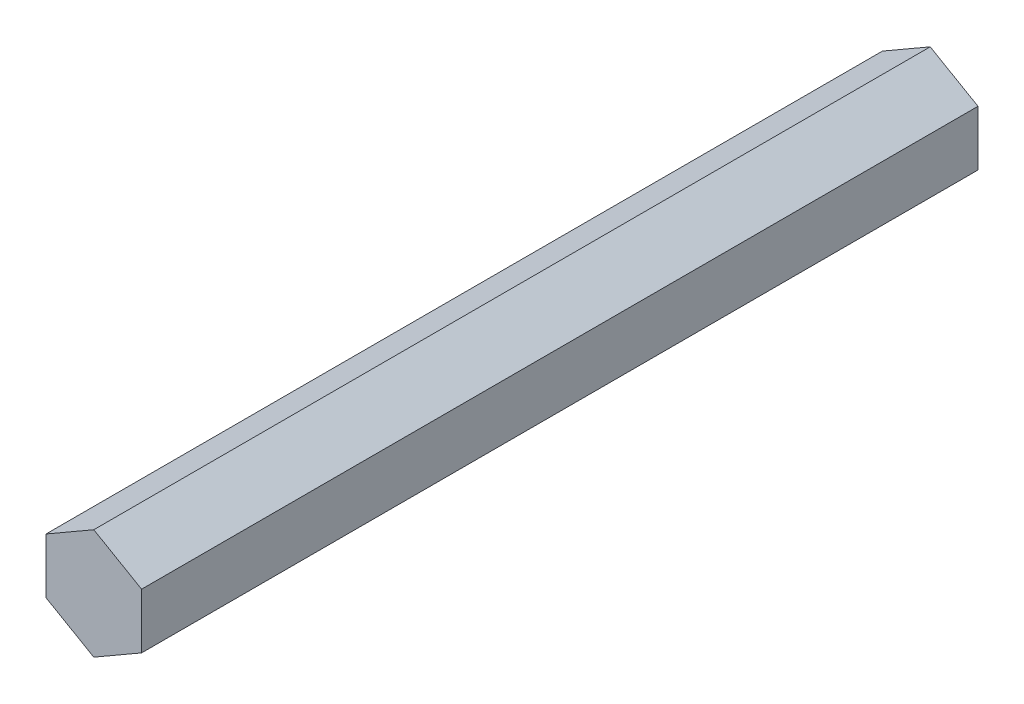
ISO-10303-21;
HEADER;
FILE_DESCRIPTION(('STEP AP214'),'2;1');
FILE_NAME('part.step','',(''),(''),'','','');
FILE_SCHEMA(('AUTOMOTIVE_DESIGN { 1 0 10303 214 1 1 1 1 }'));
ENDSEC;
DATA;
#1=APPLICATION_CONTEXT('core data for automotive mechanical design processes');
#2=APPLICATION_PROTOCOL_DEFINITION('international standard','automotive_design',2000,#1);
#3=PRODUCT_CONTEXT('',#1,'mechanical');
#4=PRODUCT('Part','Part','',(#3));
#5=PRODUCT_RELATED_PRODUCT_CATEGORY('part','',(#4));
#6=PRODUCT_DEFINITION_FORMATION('','',#4);
#7=PRODUCT_DEFINITION_CONTEXT('part definition',#1,'design');
#8=PRODUCT_DEFINITION('design','',#6,#7);
#9=PRODUCT_DEFINITION_SHAPE('','',#8);
#10=(LENGTH_UNIT() NAMED_UNIT(*) SI_UNIT(.MILLI.,.METRE.));
#11=(NAMED_UNIT(*) PLANE_ANGLE_UNIT() SI_UNIT($,.RADIAN.));
#12=(NAMED_UNIT(*) SI_UNIT($,.STERADIAN.) SOLID_ANGLE_UNIT());
#13=UNCERTAINTY_MEASURE_WITH_UNIT(LENGTH_MEASURE(1.E-05),#10,'distance_accuracy_value','');
#14=(GEOMETRIC_REPRESENTATION_CONTEXT(3) GLOBAL_UNCERTAINTY_ASSIGNED_CONTEXT((#13)) GLOBAL_UNIT_ASSIGNED_CONTEXT((#10,
#11,#12)) REPRESENTATION_CONTEXT('',''));
#15=CARTESIAN_POINT('',(0.,0.,0.));
#16=DIRECTION('',(0.,0.,1.));
#17=DIRECTION('',(1.,0.,0.));
#18=AXIS2_PLACEMENT_3D('',#15,#16,#17);
#19=CARTESIAN_POINT('',(-6.35,3.66617420935413,55.5625));
#20=DIRECTION('',(0.5,-0.866025403784439,0.));
#21=DIRECTION('',(0.866025403784439,0.5,0.));
#22=AXIS2_PLACEMENT_3D('',#19,#20,#21);
#23=PLANE('',#22);
#24=DIRECTION('',(-0.866025403784439,-0.5,0.));
#25=VECTOR('',#24,1.);
#26=CARTESIAN_POINT('',(-6.35,3.66617420935413,-55.5625));
#27=LINE('',#26,#25);
#28=CARTESIAN_POINT('',(0.,7.33234841870825,-55.5625));
#29=VERTEX_POINT('',#28);
#30=CARTESIAN_POINT('',(-6.35,3.66617420935413,-55.5625));
#31=VERTEX_POINT('',#30);
#32=EDGE_CURVE('E119',#29,#31,#27,.T.);
#33=ORIENTED_EDGE('',*,*,#32,.T.);
#34=DIRECTION('',(0.,0.,-1.));
#35=VECTOR('',#34,1.);
#36=CARTESIAN_POINT('',(-6.35,3.66617420935413,55.5625));
#37=LINE('',#36,#35);
#38=CARTESIAN_POINT('',(-6.35,3.66617420935413,55.5625));
#39=VERTEX_POINT('',#38);
#40=EDGE_CURVE('E11',#39,#31,#37,.T.);
#41=ORIENTED_EDGE('',*,*,#40,.F.);
#42=DIRECTION('',(-0.866025403784439,-0.5,0.));
#43=VECTOR('',#42,1.);
#44=CARTESIAN_POINT('',(-6.35,3.66617420935413,55.5625));
#45=LINE('',#44,#43);
#46=CARTESIAN_POINT('',(0.,7.33234841870825,55.5625));
#47=VERTEX_POINT('',#46);
#48=EDGE_CURVE('E129',#47,#39,#45,.T.);
#49=ORIENTED_EDGE('',*,*,#48,.F.);
#50=DIRECTION('',(0.,0.,-1.));
#51=VECTOR('',#50,1.);
#52=CARTESIAN_POINT('',(0.,7.33234841870825,55.5625));
#53=LINE('',#52,#51);
#54=EDGE_CURVE('E115',#47,#29,#53,.T.);
#55=ORIENTED_EDGE('',*,*,#54,.T.);
#56=EDGE_LOOP('',(#33,#41,#49,#55));
#57=FACE_BOUND('',#56,.T.);
#58=ADVANCED_FACE('F35',(#57),#23,.F.);
#59=CARTESIAN_POINT('',(-6.35,-3.66617420935412,55.5625));
#60=DIRECTION('',(1.,0.,0.));
#61=DIRECTION('',(0.,0.,-1.));
#62=AXIS2_PLACEMENT_3D('',#59,#60,#61);
#63=PLANE('',#62);
#64=DIRECTION('',(0.,-1.,0.));
#65=VECTOR('',#64,1.);
#66=CARTESIAN_POINT('',(-6.35,-3.66617420935412,-55.5625));
#67=LINE('',#66,#65);
#68=CARTESIAN_POINT('',(-6.35,-3.66617420935412,-55.5625));
#69=VERTEX_POINT('',#68);
#70=EDGE_CURVE('E122',#31,#69,#67,.T.);
#71=ORIENTED_EDGE('',*,*,#70,.T.);
#72=DIRECTION('',(0.,0.,-1.));
#73=VECTOR('',#72,1.);
#74=CARTESIAN_POINT('',(-6.35,-3.66617420935412,55.5625));
#75=LINE('',#74,#73);
#76=CARTESIAN_POINT('',(-6.35,-3.66617420935412,55.5625));
#77=VERTEX_POINT('',#76);
#78=EDGE_CURVE('E43',#77,#69,#75,.T.);
#79=ORIENTED_EDGE('',*,*,#78,.F.);
#80=DIRECTION('',(0.,-1.,0.));
#81=VECTOR('',#80,1.);
#82=CARTESIAN_POINT('',(-6.35,-3.66617420935412,55.5625));
#83=LINE('',#82,#81);
#84=EDGE_CURVE('E88',#39,#77,#83,.T.);
#85=ORIENTED_EDGE('',*,*,#84,.F.);
#86=ORIENTED_EDGE('',*,*,#40,.T.);
#87=EDGE_LOOP('',(#71,#79,#85,#86));
#88=FACE_BOUND('',#87,.T.);
#89=ADVANCED_FACE('F153',(#88),#63,.F.);
#90=CARTESIAN_POINT('',(0.,-7.33234841870824,55.5625));
#91=DIRECTION('',(0.5,0.866025403784439,0.));
#92=DIRECTION('',(-0.866025403784439,0.5,0.));
#93=AXIS2_PLACEMENT_3D('',#90,#91,#92);
#94=PLANE('',#93);
#95=DIRECTION('',(0.866025403784439,-0.5,0.));
#96=VECTOR('',#95,1.);
#97=CARTESIAN_POINT('',(0.,-7.33234841870824,-55.5625));
#98=LINE('',#97,#96);
#99=CARTESIAN_POINT('',(0.,-7.33234841870824,-55.5625));
#100=VERTEX_POINT('',#99);
#101=EDGE_CURVE('E124',#69,#100,#98,.T.);
#102=ORIENTED_EDGE('',*,*,#101,.T.);
#103=DIRECTION('',(0.,0.,-1.));
#104=VECTOR('',#103,1.);
#105=CARTESIAN_POINT('',(0.,-7.33234841870824,55.5625));
#106=LINE('',#105,#104);
#107=CARTESIAN_POINT('',(0.,-7.33234841870824,55.5625));
#108=VERTEX_POINT('',#107);
#109=EDGE_CURVE('E110',#108,#100,#106,.T.);
#110=ORIENTED_EDGE('',*,*,#109,.F.);
#111=DIRECTION('',(0.866025403784439,-0.5,0.));
#112=VECTOR('',#111,1.);
#113=CARTESIAN_POINT('',(0.,-7.33234841870824,55.5625));
#114=LINE('',#113,#112);
#115=EDGE_CURVE('E101',#77,#108,#114,.T.);
#116=ORIENTED_EDGE('',*,*,#115,.F.);
#117=ORIENTED_EDGE('',*,*,#78,.T.);
#118=EDGE_LOOP('',(#102,#110,#116,#117));
#119=FACE_BOUND('',#118,.T.);
#120=ADVANCED_FACE('F135',(#119),#94,.F.);
#121=CARTESIAN_POINT('',(6.35,-3.66617420935412,55.5625));
#122=DIRECTION('',(-0.5,0.866025403784439,0.));
#123=DIRECTION('',(-0.866025403784439,-0.5,0.));
#124=AXIS2_PLACEMENT_3D('',#121,#122,#123);
#125=PLANE('',#124);
#126=DIRECTION('',(0.866025403784439,0.5,0.));
#127=VECTOR('',#126,1.);
#128=CARTESIAN_POINT('',(6.35,-3.66617420935412,-55.5625));
#129=LINE('',#128,#127);
#130=CARTESIAN_POINT('',(6.35,-3.66617420935412,-55.5625));
#131=VERTEX_POINT('',#130);
#132=EDGE_CURVE('E109',#100,#131,#129,.T.);
#133=ORIENTED_EDGE('',*,*,#132,.T.);
#134=DIRECTION('',(0.,0.,-1.));
#135=VECTOR('',#134,1.);
#136=CARTESIAN_POINT('',(6.35,-3.66617420935412,55.5625));
#137=LINE('',#136,#135);
#138=CARTESIAN_POINT('',(6.35,-3.66617420935412,55.5625));
#139=VERTEX_POINT('',#138);
#140=EDGE_CURVE('E106',#139,#131,#137,.T.);
#141=ORIENTED_EDGE('',*,*,#140,.F.);
#142=DIRECTION('',(0.866025403784439,0.5,0.));
#143=VECTOR('',#142,1.);
#144=CARTESIAN_POINT('',(6.35,-3.66617420935412,55.5625));
#145=LINE('',#144,#143);
#146=EDGE_CURVE('E95',#108,#139,#145,.T.);
#147=ORIENTED_EDGE('',*,*,#146,.F.);
#148=ORIENTED_EDGE('',*,*,#109,.T.);
#149=EDGE_LOOP('',(#133,#141,#147,#148));
#150=FACE_BOUND('',#149,.T.);
#151=ADVANCED_FACE('F107',(#150),#125,.F.);
#152=CARTESIAN_POINT('',(6.34999999999999,3.66617420935413,55.5625));
#153=DIRECTION('',(-1.,0.,0.));
#154=DIRECTION('',(0.,-1.,0.));
#155=AXIS2_PLACEMENT_3D('',#152,#153,#154);
#156=PLANE('',#155);
#157=DIRECTION('',(0.,1.,0.));
#158=VECTOR('',#157,1.);
#159=CARTESIAN_POINT('',(6.34999999999999,3.66617420935413,-55.5625));
#160=LINE('',#159,#158);
#161=CARTESIAN_POINT('',(6.34999999999999,3.66617420935413,-55.5625));
#162=VERTEX_POINT('',#161);
#163=EDGE_CURVE('E74',#131,#162,#160,.T.);
#164=ORIENTED_EDGE('',*,*,#163,.T.);
#165=DIRECTION('',(0.,0.,-1.));
#166=VECTOR('',#165,1.);
#167=CARTESIAN_POINT('',(6.34999999999999,3.66617420935413,55.5625));
#168=LINE('',#167,#166);
#169=CARTESIAN_POINT('',(6.34999999999999,3.66617420935413,55.5625));
#170=VERTEX_POINT('',#169);
#171=EDGE_CURVE('E111',#170,#162,#168,.T.);
#172=ORIENTED_EDGE('',*,*,#171,.F.);
#173=DIRECTION('',(0.,1.,0.));
#174=VECTOR('',#173,1.);
#175=CARTESIAN_POINT('',(6.34999999999999,3.66617420935413,55.5625));
#176=LINE('',#175,#174);
#177=EDGE_CURVE('E99',#139,#170,#176,.T.);
#178=ORIENTED_EDGE('',*,*,#177,.F.);
#179=ORIENTED_EDGE('',*,*,#140,.T.);
#180=EDGE_LOOP('',(#164,#172,#178,#179));
#181=FACE_BOUND('',#180,.T.);
#182=ADVANCED_FACE('F113',(#181),#156,.F.);
#183=CARTESIAN_POINT('',(0.,7.33234841870825,55.5625));
#184=DIRECTION('',(-0.5,-0.866025403784439,0.));
#185=DIRECTION('',(0.866025403784439,-0.5,0.));
#186=AXIS2_PLACEMENT_3D('',#183,#184,#185);
#187=PLANE('',#186);
#188=DIRECTION('',(-0.866025403784439,0.5,0.));
#189=VECTOR('',#188,1.);
#190=CARTESIAN_POINT('',(0.,7.33234841870825,-55.5625));
#191=LINE('',#190,#189);
#192=EDGE_CURVE('E80',#162,#29,#191,.T.);
#193=ORIENTED_EDGE('',*,*,#192,.T.);
#194=ORIENTED_EDGE('',*,*,#54,.F.);
#195=DIRECTION('',(-0.866025403784439,0.5,0.));
#196=VECTOR('',#195,1.);
#197=CARTESIAN_POINT('',(0.,7.33234841870825,55.5625));
#198=LINE('',#197,#196);
#199=EDGE_CURVE('E51',#170,#47,#198,.T.);
#200=ORIENTED_EDGE('',*,*,#199,.F.);
#201=ORIENTED_EDGE('',*,*,#171,.T.);
#202=EDGE_LOOP('',(#193,#194,#200,#201));
#203=FACE_BOUND('',#202,.T.);
#204=ADVANCED_FACE('F142',(#203),#187,.F.);
#205=CARTESIAN_POINT('',(0.,0.,55.5625));
#206=DIRECTION('',(0.,0.,-1.));
#207=DIRECTION('',(-1.,0.,0.));
#208=AXIS2_PLACEMENT_3D('',#205,#206,#207);
#209=PLANE('',#208);
#210=ORIENTED_EDGE('',*,*,#48,.T.);
#211=ORIENTED_EDGE('',*,*,#84,.T.);
#212=ORIENTED_EDGE('',*,*,#115,.T.);
#213=ORIENTED_EDGE('',*,*,#146,.T.);
#214=ORIENTED_EDGE('',*,*,#177,.T.);
#215=ORIENTED_EDGE('',*,*,#199,.T.);
#216=EDGE_LOOP('',(#210,#211,#212,#213,#214,#215));
#217=FACE_BOUND('',#216,.T.);
#218=ADVANCED_FACE('F97',(#217),#209,.F.);
#219=CARTESIAN_POINT('',(0.,0.,-55.5625));
#220=DIRECTION('',(0.,0.,-1.));
#221=DIRECTION('',(-1.,0.,0.));
#222=AXIS2_PLACEMENT_3D('',#219,#220,#221);
#223=PLANE('',#222);
#224=ORIENTED_EDGE('',*,*,#32,.F.);
#225=ORIENTED_EDGE('',*,*,#192,.F.);
#226=ORIENTED_EDGE('',*,*,#163,.F.);
#227=ORIENTED_EDGE('',*,*,#132,.F.);
#228=ORIENTED_EDGE('',*,*,#101,.F.);
#229=ORIENTED_EDGE('',*,*,#70,.F.);
#230=EDGE_LOOP('',(#224,#225,#226,#227,#228,#229));
#231=FACE_BOUND('',#230,.T.);
#232=ADVANCED_FACE('F138',(#231),#223,.T.);
#233=CLOSED_SHELL('',(#58,#89,#120,#151,#182,#204,#218,#232));
#234=MANIFOLD_SOLID_BREP('B2',#233);
#235=ADVANCED_BREP_SHAPE_REPRESENTATION('',(#18,#234),#14);
#236=SHAPE_DEFINITION_REPRESENTATION(#9,#235);
ENDSEC;
END-ISO-10303-21;
